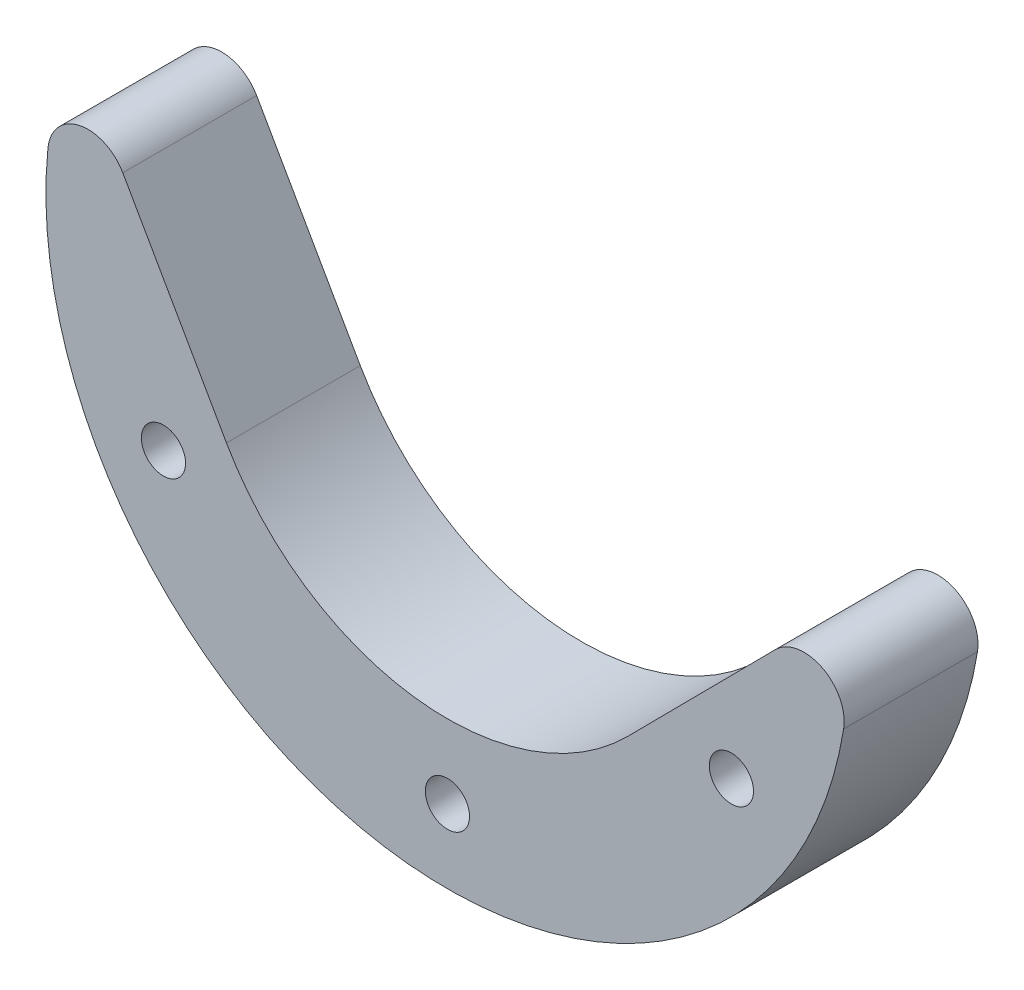
ISO-10303-21;
HEADER;
FILE_DESCRIPTION(('STEP AP214'),'2;1');
FILE_NAME('part.step','',(''),(''),'','','');
FILE_SCHEMA(('AUTOMOTIVE_DESIGN { 1 0 10303 214 1 1 1 1 }'));
ENDSEC;
DATA;
#1=APPLICATION_CONTEXT('core data for automotive mechanical design processes');
#2=APPLICATION_PROTOCOL_DEFINITION('international standard','automotive_design',2000,#1);
#3=PRODUCT_CONTEXT('',#1,'mechanical');
#4=PRODUCT('Part','Part','',(#3));
#5=PRODUCT_RELATED_PRODUCT_CATEGORY('part','',(#4));
#6=PRODUCT_DEFINITION_FORMATION('','',#4);
#7=PRODUCT_DEFINITION_CONTEXT('part definition',#1,'design');
#8=PRODUCT_DEFINITION('design','',#6,#7);
#9=PRODUCT_DEFINITION_SHAPE('','',#8);
#10=(LENGTH_UNIT() NAMED_UNIT(*) SI_UNIT(.MILLI.,.METRE.));
#11=(NAMED_UNIT(*) PLANE_ANGLE_UNIT() SI_UNIT($,.RADIAN.));
#12=(NAMED_UNIT(*) SI_UNIT($,.STERADIAN.) SOLID_ANGLE_UNIT());
#13=UNCERTAINTY_MEASURE_WITH_UNIT(LENGTH_MEASURE(1.E-05),#10,'distance_accuracy_value','');
#14=(GEOMETRIC_REPRESENTATION_CONTEXT(3) GLOBAL_UNCERTAINTY_ASSIGNED_CONTEXT((#13)) GLOBAL_UNIT_ASSIGNED_CONTEXT((#10,
#11,#12)) REPRESENTATION_CONTEXT('',''));
#15=CARTESIAN_POINT('',(0.,0.,0.));
#16=DIRECTION('',(0.,0.,1.));
#17=DIRECTION('',(1.,0.,0.));
#18=AXIS2_PLACEMENT_3D('',#15,#16,#17);
#19=CARTESIAN_POINT('',(-16.5122050842531,-9.39931291401484,10.));
#20=DIRECTION('',(-0.869063425487005,-0.494700679684992,0.));
#21=DIRECTION('',(0.494700679684992,-0.869063425487005,0.));
#22=AXIS2_PLACEMENT_3D('',#19,#20,#21);
#23=PLANE('',#22);
#24=DIRECTION('',(-0.494700679684992,0.869063425487005,0.));
#25=VECTOR('',#24,1.);
#26=CARTESIAN_POINT('',(-16.5122050842531,-9.39931291401484,0.));
#27=LINE('',#26,#25);
#28=CARTESIAN_POINT('',(-16.5122050842531,-9.39931291401485,0.));
#29=VERTEX_POINT('',#28);
#30=CARTESIAN_POINT('',(-24.25549552229,4.20368135901951,0.));
#31=VERTEX_POINT('',#30);
#32=EDGE_CURVE('E128',#29,#31,#27,.T.);
#33=ORIENTED_EDGE('',*,*,#32,.T.);
#34=DIRECTION('',(0.,0.,-1.));
#35=VECTOR('',#34,1.);
#36=CARTESIAN_POINT('',(-24.25549552229,4.20368135901951,10.));
#37=LINE('',#36,#35);
#38=CARTESIAN_POINT('',(-24.25549552229,4.20368135901951,10.));
#39=VERTEX_POINT('',#38);
#40=EDGE_CURVE('E11',#31,#39,#37,.F.);
#41=ORIENTED_EDGE('',*,*,#40,.T.);
#42=DIRECTION('',(-0.494700679684992,0.869063425487005,0.));
#43=VECTOR('',#42,1.);
#44=CARTESIAN_POINT('',(-16.5122050842531,-9.39931291401484,10.));
#45=LINE('',#44,#43);
#46=CARTESIAN_POINT('',(-16.5122050842531,-9.39931291401485,10.));
#47=VERTEX_POINT('',#46);
#48=EDGE_CURVE('E144',#47,#39,#45,.T.);
#49=ORIENTED_EDGE('',*,*,#48,.F.);
#50=DIRECTION('',(0.,0.,-1.));
#51=VECTOR('',#50,1.);
#52=CARTESIAN_POINT('',(-16.5122050842531,-9.39931291401485,10.));
#53=LINE('',#52,#51);
#54=EDGE_CURVE('E105',#47,#29,#53,.T.);
#55=ORIENTED_EDGE('',*,*,#54,.T.);
#56=EDGE_LOOP('',(#33,#41,#49,#55));
#57=FACE_BOUND('',#56,.T.);
#58=ADVANCED_FACE('F37',(#57),#23,.F.);
#59=CARTESIAN_POINT('',(0.,0.,10.));
#60=DIRECTION('',(0.,0.,-1.));
#61=DIRECTION('',(-1.,0.,0.));
#62=AXIS2_PLACEMENT_3D('',#59,#60,#61);
#63=CYLINDRICAL_SURFACE('',#62,30.);
#64=CARTESIAN_POINT('',(0.,0.,0.));
#65=DIRECTION('',(0.,0.,1.));
#66=DIRECTION('',(1.,0.,0.));
#67=AXIS2_PLACEMENT_3D('',#64,#65,#66);
#68=CIRCLE('',#67,30.);
#69=CARTESIAN_POINT('',(-29.8474286652789,3.02175479996059,0.));
#70=VERTEX_POINT('',#69);
#71=CARTESIAN_POINT('',(29.6049036523466,-4.85280122560906,0.));
#72=VERTEX_POINT('',#71);
#73=EDGE_CURVE('E130',#70,#72,#68,.T.);
#74=ORIENTED_EDGE('',*,*,#73,.T.);
#75=DIRECTION('',(0.,0.,-1.));
#76=VECTOR('',#75,1.);
#77=CARTESIAN_POINT('',(29.6049036523466,-4.85280122560907,10.));
#78=LINE('',#77,#76);
#79=CARTESIAN_POINT('',(29.6049036523466,-4.85280122560906,10.));
#80=VERTEX_POINT('',#79);
#81=EDGE_CURVE('E58',#72,#80,#78,.F.);
#82=ORIENTED_EDGE('',*,*,#81,.T.);
#83=CARTESIAN_POINT('',(0.,0.,10.));
#84=DIRECTION('',(0.,0.,1.));
#85=DIRECTION('',(1.,0.,0.));
#86=AXIS2_PLACEMENT_3D('',#83,#84,#85);
#87=CIRCLE('',#86,30.);
#88=CARTESIAN_POINT('',(-29.8474286652789,3.02175479996059,10.));
#89=VERTEX_POINT('',#88);
#90=EDGE_CURVE('E113',#89,#80,#87,.T.);
#91=ORIENTED_EDGE('',*,*,#90,.F.);
#92=DIRECTION('',(0.,0.,-1.));
#93=VECTOR('',#92,1.);
#94=CARTESIAN_POINT('',(-29.8474286652789,3.02175479996059,10.));
#95=LINE('',#94,#93);
#96=EDGE_CURVE('E151',#89,#70,#95,.T.);
#97=ORIENTED_EDGE('',*,*,#96,.T.);
#98=EDGE_LOOP('',(#74,#82,#91,#97));
#99=FACE_BOUND('',#98,.T.);
#100=ADVANCED_FACE('F159',(#99),#63,.T.);
#101=CARTESIAN_POINT('',(13.4958530883794,-13.3739279726219,10.));
#102=DIRECTION('',(-0.710308057283127,0.703890945927471,0.));
#103=DIRECTION('',(-0.703890945927471,-0.710308057283127,0.));
#104=AXIS2_PLACEMENT_3D('',#101,#102,#103);
#105=PLANE('',#104);
#106=DIRECTION('',(0.703890945927471,0.710308057283127,0.));
#107=VECTOR('',#106,1.);
#108=CARTESIAN_POINT('',(13.4958530883794,-13.3739279726219,10.));
#109=LINE('',#108,#107);
#110=CARTESIAN_POINT('',(13.4958530883794,-13.3739279726219,10.));
#111=VERTEX_POINT('',#110);
#112=CARTESIAN_POINT('',(24.5134891152626,-2.25584826526574,10.));
#113=VERTEX_POINT('',#112);
#114=EDGE_CURVE('E96',#111,#113,#109,.T.);
#115=ORIENTED_EDGE('',*,*,#114,.T.);
#116=DIRECTION('',(0.,0.,1.));
#117=VECTOR('',#116,1.);
#118=CARTESIAN_POINT('',(24.5134891152626,-2.25584826526574,0.));
#119=LINE('',#118,#117);
#120=CARTESIAN_POINT('',(24.5134891152626,-2.25584826526574,0.));
#121=VERTEX_POINT('',#120);
#122=EDGE_CURVE('E104',#113,#121,#119,.F.);
#123=ORIENTED_EDGE('',*,*,#122,.T.);
#124=DIRECTION('',(0.703890945927471,0.710308057283127,0.));
#125=VECTOR('',#124,1.);
#126=CARTESIAN_POINT('',(13.4958530883794,-13.3739279726219,0.));
#127=LINE('',#126,#125);
#128=CARTESIAN_POINT('',(13.4958530883794,-13.3739279726219,0.));
#129=VERTEX_POINT('',#128);
#130=EDGE_CURVE('E99',#129,#121,#127,.T.);
#131=ORIENTED_EDGE('',*,*,#130,.F.);
#132=DIRECTION('',(0.,0.,-1.));
#133=VECTOR('',#132,1.);
#134=CARTESIAN_POINT('',(13.4958530883794,-13.3739279726219,10.));
#135=LINE('',#134,#133);
#136=EDGE_CURVE('E92',#111,#129,#135,.T.);
#137=ORIENTED_EDGE('',*,*,#136,.F.);
#138=EDGE_LOOP('',(#115,#123,#131,#137));
#139=FACE_BOUND('',#138,.T.);
#140=ADVANCED_FACE('F94',(#139),#105,.T.);
#141=CARTESIAN_POINT('',(-21.2176223927188,-12.25,10.));
#142=DIRECTION('',(0.,0.,-1.));
#143=DIRECTION('',(-1.,0.,0.));
#144=AXIS2_PLACEMENT_3D('',#141,#142,#143);
#145=CYLINDRICAL_SURFACE('',#144,1.65);
#146=CARTESIAN_POINT('',(-21.2176223927188,-12.25,10.));
#147=DIRECTION('',(0.,0.,1.));
#148=DIRECTION('',(1.,0.,0.));
#149=AXIS2_PLACEMENT_3D('',#146,#147,#148);
#150=CIRCLE('',#149,1.65);
#151=CARTESIAN_POINT('',(-19.5676223927188,-12.25,10.));
#152=VERTEX_POINT('',#151);
#153=EDGE_CURVE('E119',#152,#152,#150,.T.);
#154=ORIENTED_EDGE('',*,*,#153,.T.);
#155=EDGE_LOOP('',(#154));
#156=FACE_BOUND('',#155,.T.);
#157=CARTESIAN_POINT('',(-21.2176223927188,-12.25,0.));
#158=DIRECTION('',(0.,0.,1.));
#159=DIRECTION('',(1.,0.,0.));
#160=AXIS2_PLACEMENT_3D('',#157,#158,#159);
#161=CIRCLE('',#160,1.65);
#162=CARTESIAN_POINT('',(-19.5676223927188,-12.25,0.));
#163=VERTEX_POINT('',#162);
#164=EDGE_CURVE('E138',#163,#163,#161,.T.);
#165=ORIENTED_EDGE('',*,*,#164,.F.);
#166=EDGE_LOOP('',(#165));
#167=FACE_BOUND('',#166,.T.);
#168=ADVANCED_FACE('F190',(#156,#167),#145,.F.);
#169=CARTESIAN_POINT('',(0.,-24.5,10.));
#170=DIRECTION('',(0.,0.,-1.));
#171=DIRECTION('',(-1.,0.,0.));
#172=AXIS2_PLACEMENT_3D('',#169,#170,#171);
#173=CYLINDRICAL_SURFACE('',#172,1.65);
#174=CARTESIAN_POINT('',(0.,-24.5,10.));
#175=DIRECTION('',(0.,0.,1.));
#176=DIRECTION('',(1.,0.,0.));
#177=AXIS2_PLACEMENT_3D('',#174,#175,#176);
#178=CIRCLE('',#177,1.65);
#179=CARTESIAN_POINT('',(1.65,-24.5,10.));
#180=VERTEX_POINT('',#179);
#181=EDGE_CURVE('E116',#180,#180,#178,.T.);
#182=ORIENTED_EDGE('',*,*,#181,.T.);
#183=EDGE_LOOP('',(#182));
#184=FACE_BOUND('',#183,.T.);
#185=CARTESIAN_POINT('',(0.,-24.5,0.));
#186=DIRECTION('',(0.,0.,1.));
#187=DIRECTION('',(1.,0.,0.));
#188=AXIS2_PLACEMENT_3D('',#185,#186,#187);
#189=CIRCLE('',#188,1.65);
#190=CARTESIAN_POINT('',(1.65,-24.5,0.));
#191=VERTEX_POINT('',#190);
#192=EDGE_CURVE('E135',#191,#191,#189,.T.);
#193=ORIENTED_EDGE('',*,*,#192,.F.);
#194=EDGE_LOOP('',(#193));
#195=FACE_BOUND('',#194,.T.);
#196=ADVANCED_FACE('F193',(#184,#195),#173,.F.);
#197=CARTESIAN_POINT('',(0.,0.,10.));
#198=DIRECTION('',(0.,0.,-1.));
#199=DIRECTION('',(-1.,0.,0.));
#200=AXIS2_PLACEMENT_3D('',#197,#198,#199);
#201=CYLINDRICAL_SURFACE('',#200,19.);
#202=CARTESIAN_POINT('',(0.,0.,0.));
#203=DIRECTION('',(0.,0.,1.));
#204=DIRECTION('',(1.,0.,0.));
#205=AXIS2_PLACEMENT_3D('',#202,#203,#204);
#206=CIRCLE('',#205,19.);
#207=EDGE_CURVE('E133',#29,#129,#206,.T.);
#208=ORIENTED_EDGE('',*,*,#207,.F.);
#209=ORIENTED_EDGE('',*,*,#54,.F.);
#210=CARTESIAN_POINT('',(0.,0.,10.));
#211=DIRECTION('',(0.,0.,1.));
#212=DIRECTION('',(1.,0.,0.));
#213=AXIS2_PLACEMENT_3D('',#210,#211,#212);
#214=CIRCLE('',#213,19.);
#215=EDGE_CURVE('E111',#47,#111,#214,.T.);
#216=ORIENTED_EDGE('',*,*,#215,.T.);
#217=ORIENTED_EDGE('',*,*,#136,.T.);
#218=EDGE_LOOP('',(#208,#209,#216,#217));
#219=FACE_BOUND('',#218,.T.);
#220=ADVANCED_FACE('F115',(#219),#201,.F.);
#221=CARTESIAN_POINT('',(21.2176223927188,-12.2499999999999,10.));
#222=DIRECTION('',(0.,0.,-1.));
#223=DIRECTION('',(-1.,0.,0.));
#224=AXIS2_PLACEMENT_3D('',#221,#222,#223);
#225=CYLINDRICAL_SURFACE('',#224,1.65);
#226=CARTESIAN_POINT('',(21.2176223927188,-12.2499999999999,10.));
#227=DIRECTION('',(0.,0.,1.));
#228=DIRECTION('',(1.,0.,0.));
#229=AXIS2_PLACEMENT_3D('',#226,#227,#228);
#230=CIRCLE('',#229,1.65);
#231=CARTESIAN_POINT('',(22.8676223927188,-12.2499999999999,10.));
#232=VERTEX_POINT('',#231);
#233=EDGE_CURVE('E125',#232,#232,#230,.F.);
#234=ORIENTED_EDGE('',*,*,#233,.F.);
#235=EDGE_LOOP('',(#234));
#236=FACE_BOUND('',#235,.T.);
#237=CARTESIAN_POINT('',(21.2176223927188,-12.2499999999999,0.));
#238=DIRECTION('',(0.,0.,1.));
#239=DIRECTION('',(1.,0.,0.));
#240=AXIS2_PLACEMENT_3D('',#237,#238,#239);
#241=CIRCLE('',#240,1.65);
#242=CARTESIAN_POINT('',(22.8676223927188,-12.2499999999999,0.));
#243=VERTEX_POINT('',#242);
#244=EDGE_CURVE('E141',#243,#243,#241,.F.);
#245=ORIENTED_EDGE('',*,*,#244,.T.);
#246=EDGE_LOOP('',(#245));
#247=FACE_BOUND('',#246,.T.);
#248=ADVANCED_FACE('F184',(#236,#247),#225,.F.);
#249=CARTESIAN_POINT('',(0.,0.,10.));
#250=DIRECTION('',(0.,0.,1.));
#251=DIRECTION('',(1.,0.,0.));
#252=AXIS2_PLACEMENT_3D('',#249,#250,#251);
#253=PLANE('',#252);
#254=ORIENTED_EDGE('',*,*,#90,.T.);
#255=CARTESIAN_POINT('',(26.644413287112,-4.36752110304816,10.));
#256=DIRECTION('',(0.,0.,1.));
#257=DIRECTION('',(1.,0.,0.));
#258=AXIS2_PLACEMENT_3D('',#255,#256,#257);
#259=CIRCLE('',#258,3.);
#260=EDGE_CURVE('E45',#80,#113,#259,.T.);
#261=ORIENTED_EDGE('',*,*,#260,.T.);
#262=ORIENTED_EDGE('',*,*,#114,.F.);
#263=ORIENTED_EDGE('',*,*,#215,.F.);
#264=ORIENTED_EDGE('',*,*,#48,.T.);
#265=CARTESIAN_POINT('',(-26.862685798751,2.71957931996453,10.));
#266=DIRECTION('',(0.,0.,1.));
#267=DIRECTION('',(1.,0.,0.));
#268=AXIS2_PLACEMENT_3D('',#265,#266,#267);
#269=CIRCLE('',#268,3.);
#270=EDGE_CURVE('E155',#39,#89,#269,.T.);
#271=ORIENTED_EDGE('',*,*,#270,.T.);
#272=EDGE_LOOP('',(#254,#261,#262,#263,#264,#271));
#273=FACE_BOUND('',#272,.T.);
#274=ORIENTED_EDGE('',*,*,#181,.F.);
#275=EDGE_LOOP('',(#274));
#276=FACE_BOUND('',#275,.T.);
#277=ORIENTED_EDGE('',*,*,#153,.F.);
#278=EDGE_LOOP('',(#277));
#279=FACE_BOUND('',#278,.T.);
#280=ORIENTED_EDGE('',*,*,#233,.T.);
#281=EDGE_LOOP('',(#280));
#282=FACE_BOUND('',#281,.T.);
#283=ADVANCED_FACE('F109',(#273,#276,#279,#282),#253,.T.);
#284=CARTESIAN_POINT('',(0.,0.,0.));
#285=DIRECTION('',(0.,0.,1.));
#286=DIRECTION('',(1.,0.,0.));
#287=AXIS2_PLACEMENT_3D('',#284,#285,#286);
#288=PLANE('',#287);
#289=ORIENTED_EDGE('',*,*,#130,.T.);
#290=CARTESIAN_POINT('',(26.644413287112,-4.36752110304816,0.));
#291=DIRECTION('',(0.,0.,1.));
#292=DIRECTION('',(1.,0.,0.));
#293=AXIS2_PLACEMENT_3D('',#290,#291,#292);
#294=CIRCLE('',#293,3.);
#295=EDGE_CURVE('E149',#121,#72,#294,.F.);
#296=ORIENTED_EDGE('',*,*,#295,.T.);
#297=ORIENTED_EDGE('',*,*,#73,.F.);
#298=CARTESIAN_POINT('',(-26.862685798751,2.71957931996453,0.));
#299=DIRECTION('',(0.,0.,1.));
#300=DIRECTION('',(1.,0.,0.));
#301=AXIS2_PLACEMENT_3D('',#298,#299,#300);
#302=CIRCLE('',#301,3.);
#303=EDGE_CURVE('E147',#70,#31,#302,.F.);
#304=ORIENTED_EDGE('',*,*,#303,.T.);
#305=ORIENTED_EDGE('',*,*,#32,.F.);
#306=ORIENTED_EDGE('',*,*,#207,.T.);
#307=EDGE_LOOP('',(#289,#296,#297,#304,#305,#306));
#308=FACE_BOUND('',#307,.T.);
#309=ORIENTED_EDGE('',*,*,#192,.T.);
#310=EDGE_LOOP('',(#309));
#311=FACE_BOUND('',#310,.T.);
#312=ORIENTED_EDGE('',*,*,#164,.T.);
#313=EDGE_LOOP('',(#312));
#314=FACE_BOUND('',#313,.T.);
#315=ORIENTED_EDGE('',*,*,#244,.F.);
#316=EDGE_LOOP('',(#315));
#317=FACE_BOUND('',#316,.T.);
#318=ADVANCED_FACE('F163',(#308,#311,#314,#317),#288,.F.);
#319=CARTESIAN_POINT('',(26.644413287112,-4.36752110304816,10.));
#320=DIRECTION('',(0.,0.,-1.));
#321=DIRECTION('',(-1.,0.,0.));
#322=AXIS2_PLACEMENT_3D('',#319,#320,#321);
#323=CYLINDRICAL_SURFACE('',#322,3.);
#324=ORIENTED_EDGE('',*,*,#260,.F.);
#325=ORIENTED_EDGE('',*,*,#81,.F.);
#326=ORIENTED_EDGE('',*,*,#295,.F.);
#327=ORIENTED_EDGE('',*,*,#122,.F.);
#328=EDGE_LOOP('',(#324,#325,#326,#327));
#329=FACE_BOUND('',#328,.T.);
#330=ADVANCED_FACE('F173',(#329),#323,.T.);
#331=CARTESIAN_POINT('',(-26.862685798751,2.71957931996453,10.));
#332=DIRECTION('',(0.,0.,-1.));
#333=DIRECTION('',(-1.,0.,0.));
#334=AXIS2_PLACEMENT_3D('',#331,#332,#333);
#335=CYLINDRICAL_SURFACE('',#334,3.);
#336=ORIENTED_EDGE('',*,*,#270,.F.);
#337=ORIENTED_EDGE('',*,*,#40,.F.);
#338=ORIENTED_EDGE('',*,*,#303,.F.);
#339=ORIENTED_EDGE('',*,*,#96,.F.);
#340=EDGE_LOOP('',(#336,#337,#338,#339));
#341=FACE_BOUND('',#340,.T.);
#342=ADVANCED_FACE('F39',(#341),#335,.T.);
#343=CLOSED_SHELL('',(#58,#100,#140,#168,#196,#220,#248,#283,#318,#330,#342));
#344=MANIFOLD_SOLID_BREP('B2',#343);
#345=ADVANCED_BREP_SHAPE_REPRESENTATION('',(#18,#344),#14);
#346=SHAPE_DEFINITION_REPRESENTATION(#9,#345);
ENDSEC;
END-ISO-10303-21;
